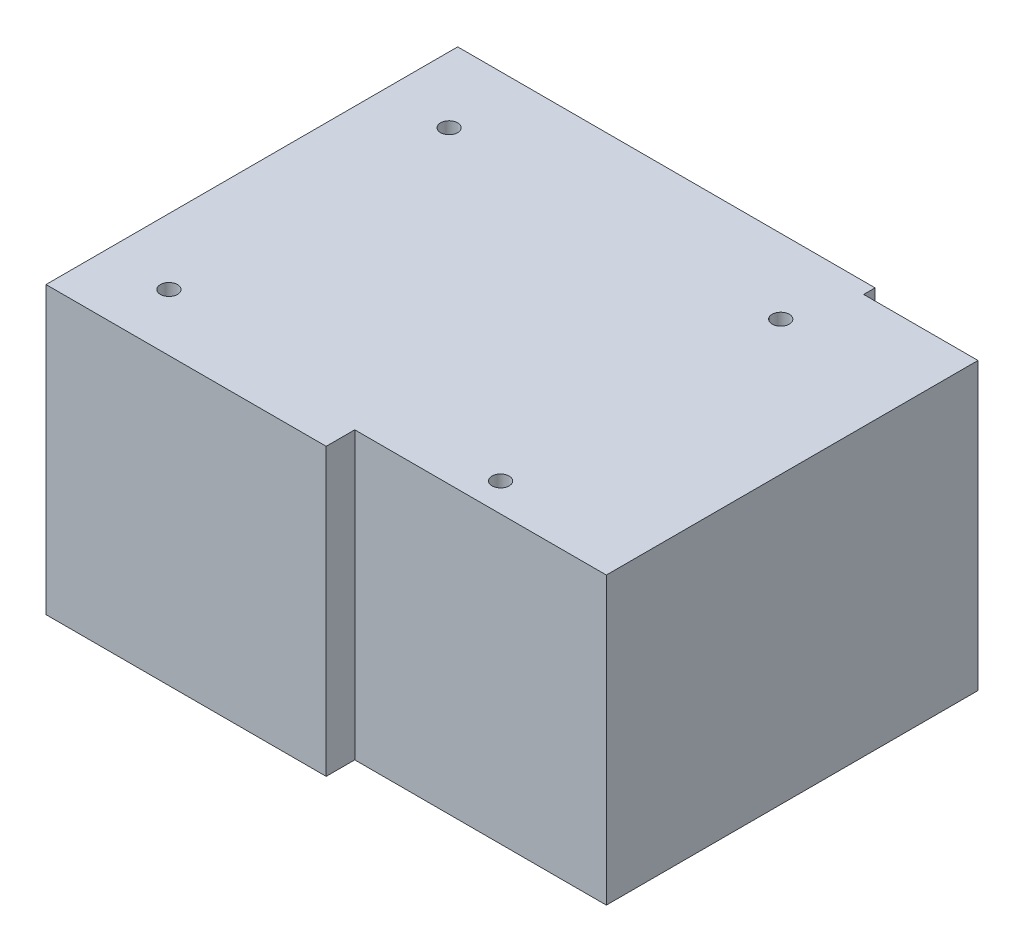
ISO-10303-21;
HEADER;
FILE_DESCRIPTION(('STEP AP214'),'2;1');
FILE_NAME('part.step','',(''),(''),'','','');
FILE_SCHEMA(('AUTOMOTIVE_DESIGN { 1 0 10303 214 1 1 1 1 }'));
ENDSEC;
DATA;
#1=APPLICATION_CONTEXT('core data for automotive mechanical design processes');
#2=APPLICATION_PROTOCOL_DEFINITION('international standard','automotive_design',2000,#1);
#3=PRODUCT_CONTEXT('',#1,'mechanical');
#4=PRODUCT('Part','Part','',(#3));
#5=PRODUCT_RELATED_PRODUCT_CATEGORY('part','',(#4));
#6=PRODUCT_DEFINITION_FORMATION('','',#4);
#7=PRODUCT_DEFINITION_CONTEXT('part definition',#1,'design');
#8=PRODUCT_DEFINITION('design','',#6,#7);
#9=PRODUCT_DEFINITION_SHAPE('','',#8);
#10=(LENGTH_UNIT() NAMED_UNIT(*) SI_UNIT(.MILLI.,.METRE.));
#11=(NAMED_UNIT(*) PLANE_ANGLE_UNIT() SI_UNIT($,.RADIAN.));
#12=(NAMED_UNIT(*) SI_UNIT($,.STERADIAN.) SOLID_ANGLE_UNIT());
#13=UNCERTAINTY_MEASURE_WITH_UNIT(LENGTH_MEASURE(1.E-05),#10,'distance_accuracy_value','');
#14=(GEOMETRIC_REPRESENTATION_CONTEXT(3) GLOBAL_UNCERTAINTY_ASSIGNED_CONTEXT((#13)) GLOBAL_UNIT_ASSIGNED_CONTEXT((#10,
#11,#12)) REPRESENTATION_CONTEXT('',''));
#15=CARTESIAN_POINT('',(0.,0.,0.));
#16=DIRECTION('',(0.,0.,1.));
#17=DIRECTION('',(1.,0.,0.));
#18=AXIS2_PLACEMENT_3D('',#15,#16,#17);
#19=CARTESIAN_POINT('',(0.,50.,0.));
#20=DIRECTION('',(1.,0.,0.));
#21=DIRECTION('',(0.,0.,-1.));
#22=AXIS2_PLACEMENT_3D('',#19,#20,#21);
#23=PLANE('',#22);
#24=DIRECTION('',(0.,0.,1.));
#25=VECTOR('',#24,1.);
#26=CARTESIAN_POINT('',(0.,0.,0.));
#27=LINE('',#26,#25);
#28=CARTESIAN_POINT('',(0.,0.,-72.));
#29=VERTEX_POINT('',#28);
#30=CARTESIAN_POINT('',(0.,0.,0.));
#31=VERTEX_POINT('',#30);
#32=EDGE_CURVE('E130',#29,#31,#27,.T.);
#33=ORIENTED_EDGE('',*,*,#32,.T.);
#34=DIRECTION('',(0.,-1.,0.));
#35=VECTOR('',#34,1.);
#36=CARTESIAN_POINT('',(0.,50.,0.));
#37=LINE('',#36,#35);
#38=CARTESIAN_POINT('',(0.,50.,0.));
#39=VERTEX_POINT('',#38);
#40=EDGE_CURVE('E11',#39,#31,#37,.T.);
#41=ORIENTED_EDGE('',*,*,#40,.F.);
#42=DIRECTION('',(0.,0.,1.));
#43=VECTOR('',#42,1.);
#44=CARTESIAN_POINT('',(0.,50.,0.));
#45=LINE('',#44,#43);
#46=CARTESIAN_POINT('',(0.,50.,-72.));
#47=VERTEX_POINT('',#46);
#48=EDGE_CURVE('E146',#47,#39,#45,.T.);
#49=ORIENTED_EDGE('',*,*,#48,.F.);
#50=DIRECTION('',(0.,-1.,0.));
#51=VECTOR('',#50,1.);
#52=CARTESIAN_POINT('',(0.,50.,-72.));
#53=LINE('',#52,#51);
#54=EDGE_CURVE('E126',#47,#29,#53,.T.);
#55=ORIENTED_EDGE('',*,*,#54,.T.);
#56=EDGE_LOOP('',(#33,#41,#49,#55));
#57=FACE_BOUND('',#56,.T.);
#58=ADVANCED_FACE('F33',(#57),#23,.F.);
#59=CARTESIAN_POINT('',(0.,50.,0.));
#60=DIRECTION('',(0.,0.,-1.));
#61=DIRECTION('',(-1.,0.,0.));
#62=AXIS2_PLACEMENT_3D('',#59,#60,#61);
#63=PLANE('',#62);
#64=DIRECTION('',(1.,0.,0.));
#65=VECTOR('',#64,1.);
#66=CARTESIAN_POINT('',(0.,0.,0.));
#67=LINE('',#66,#65);
#68=CARTESIAN_POINT('',(49.,0.,0.));
#69=VERTEX_POINT('',#68);
#70=EDGE_CURVE('E133',#31,#69,#67,.T.);
#71=ORIENTED_EDGE('',*,*,#70,.T.);
#72=DIRECTION('',(0.,-1.,0.));
#73=VECTOR('',#72,1.);
#74=CARTESIAN_POINT('',(49.,50.,0.));
#75=LINE('',#74,#73);
#76=CARTESIAN_POINT('',(49.,50.,0.));
#77=VERTEX_POINT('',#76);
#78=EDGE_CURVE('E41',#77,#69,#75,.T.);
#79=ORIENTED_EDGE('',*,*,#78,.F.);
#80=DIRECTION('',(1.,0.,0.));
#81=VECTOR('',#80,1.);
#82=CARTESIAN_POINT('',(0.,50.,0.));
#83=LINE('',#82,#81);
#84=EDGE_CURVE('E90',#39,#77,#83,.T.);
#85=ORIENTED_EDGE('',*,*,#84,.F.);
#86=ORIENTED_EDGE('',*,*,#40,.T.);
#87=EDGE_LOOP('',(#71,#79,#85,#86));
#88=FACE_BOUND('',#87,.T.);
#89=ADVANCED_FACE('F235',(#88),#63,.F.);
#90=CARTESIAN_POINT('',(49.,50.,0.));
#91=DIRECTION('',(-1.,0.,0.));
#92=DIRECTION('',(0.,0.,1.));
#93=AXIS2_PLACEMENT_3D('',#90,#91,#92);
#94=PLANE('',#93);
#95=DIRECTION('',(0.,0.,-1.));
#96=VECTOR('',#95,1.);
#97=CARTESIAN_POINT('',(49.,0.,0.));
#98=LINE('',#97,#96);
#99=CARTESIAN_POINT('',(49.,0.,-5.));
#100=VERTEX_POINT('',#99);
#101=EDGE_CURVE('E136',#69,#100,#98,.T.);
#102=ORIENTED_EDGE('',*,*,#101,.T.);
#103=DIRECTION('',(0.,-1.,0.));
#104=VECTOR('',#103,1.);
#105=CARTESIAN_POINT('',(49.,50.,-5.));
#106=LINE('',#105,#104);
#107=CARTESIAN_POINT('',(49.,50.,-5.));
#108=VERTEX_POINT('',#107);
#109=EDGE_CURVE('E153',#108,#100,#106,.T.);
#110=ORIENTED_EDGE('',*,*,#109,.F.);
#111=DIRECTION('',(0.,0.,-1.));
#112=VECTOR('',#111,1.);
#113=CARTESIAN_POINT('',(49.,50.,0.));
#114=LINE('',#113,#112);
#115=EDGE_CURVE('E161',#77,#108,#114,.T.);
#116=ORIENTED_EDGE('',*,*,#115,.F.);
#117=ORIENTED_EDGE('',*,*,#78,.T.);
#118=EDGE_LOOP('',(#102,#110,#116,#117));
#119=FACE_BOUND('',#118,.T.);
#120=ADVANCED_FACE('F159',(#119),#94,.F.);
#121=CARTESIAN_POINT('',(49.,50.,-5.));
#122=DIRECTION('',(0.,0.,-1.));
#123=DIRECTION('',(-1.,0.,0.));
#124=AXIS2_PLACEMENT_3D('',#121,#122,#123);
#125=PLANE('',#124);
#126=DIRECTION('',(1.,0.,0.));
#127=VECTOR('',#126,1.);
#128=CARTESIAN_POINT('',(49.,0.,-5.));
#129=LINE('',#128,#127);
#130=CARTESIAN_POINT('',(93.,0.,-5.));
#131=VERTEX_POINT('',#130);
#132=EDGE_CURVE('E138',#100,#131,#129,.T.);
#133=ORIENTED_EDGE('',*,*,#132,.T.);
#134=DIRECTION('',(0.,-1.,0.));
#135=VECTOR('',#134,1.);
#136=CARTESIAN_POINT('',(93.,50.,-5.));
#137=LINE('',#136,#135);
#138=CARTESIAN_POINT('',(93.,50.,-5.));
#139=VERTEX_POINT('',#138);
#140=EDGE_CURVE('E150',#139,#131,#137,.T.);
#141=ORIENTED_EDGE('',*,*,#140,.F.);
#142=DIRECTION('',(1.,0.,0.));
#143=VECTOR('',#142,1.);
#144=CARTESIAN_POINT('',(49.,50.,-5.));
#145=LINE('',#144,#143);
#146=EDGE_CURVE('E171',#108,#139,#145,.T.);
#147=ORIENTED_EDGE('',*,*,#146,.F.);
#148=ORIENTED_EDGE('',*,*,#109,.T.);
#149=EDGE_LOOP('',(#133,#141,#147,#148));
#150=FACE_BOUND('',#149,.T.);
#151=ADVANCED_FACE('F167',(#150),#125,.F.);
#152=CARTESIAN_POINT('',(93.,50.,-70.));
#153=DIRECTION('',(-1.,0.,0.));
#154=DIRECTION('',(0.,0.,1.));
#155=AXIS2_PLACEMENT_3D('',#152,#153,#154);
#156=PLANE('',#155);
#157=DIRECTION('',(0.,0.,-1.));
#158=VECTOR('',#157,1.);
#159=CARTESIAN_POINT('',(93.,0.,-70.));
#160=LINE('',#159,#158);
#161=CARTESIAN_POINT('',(93.,0.,-70.));
#162=VERTEX_POINT('',#161);
#163=EDGE_CURVE('E140',#131,#162,#160,.T.);
#164=ORIENTED_EDGE('',*,*,#163,.T.);
#165=DIRECTION('',(0.,-1.,0.));
#166=VECTOR('',#165,1.);
#167=CARTESIAN_POINT('',(93.,50.,-70.));
#168=LINE('',#167,#166);
#169=CARTESIAN_POINT('',(93.,50.,-70.));
#170=VERTEX_POINT('',#169);
#171=EDGE_CURVE('E121',#170,#162,#168,.T.);
#172=ORIENTED_EDGE('',*,*,#171,.F.);
#173=DIRECTION('',(0.,0.,-1.));
#174=VECTOR('',#173,1.);
#175=CARTESIAN_POINT('',(93.,50.,-70.));
#176=LINE('',#175,#174);
#177=EDGE_CURVE('E110',#139,#170,#176,.T.);
#178=ORIENTED_EDGE('',*,*,#177,.F.);
#179=ORIENTED_EDGE('',*,*,#140,.T.);
#180=EDGE_LOOP('',(#164,#172,#178,#179));
#181=FACE_BOUND('',#180,.T.);
#182=ADVANCED_FACE('F170',(#181),#156,.F.);
#183=CARTESIAN_POINT('',(73.,50.,-70.));
#184=DIRECTION('',(0.,0.,1.));
#185=DIRECTION('',(1.,0.,0.));
#186=AXIS2_PLACEMENT_3D('',#183,#184,#185);
#187=PLANE('',#186);
#188=DIRECTION('',(-1.,0.,0.));
#189=VECTOR('',#188,1.);
#190=CARTESIAN_POINT('',(73.,0.,-70.));
#191=LINE('',#190,#189);
#192=CARTESIAN_POINT('',(73.,0.,-70.));
#193=VERTEX_POINT('',#192);
#194=EDGE_CURVE('E119',#162,#193,#191,.T.);
#195=ORIENTED_EDGE('',*,*,#194,.T.);
#196=DIRECTION('',(0.,-1.,0.));
#197=VECTOR('',#196,1.);
#198=CARTESIAN_POINT('',(73.,50.,-70.));
#199=LINE('',#198,#197);
#200=CARTESIAN_POINT('',(73.,50.,-70.));
#201=VERTEX_POINT('',#200);
#202=EDGE_CURVE('E116',#201,#193,#199,.T.);
#203=ORIENTED_EDGE('',*,*,#202,.F.);
#204=DIRECTION('',(-1.,0.,0.));
#205=VECTOR('',#204,1.);
#206=CARTESIAN_POINT('',(73.,50.,-70.));
#207=LINE('',#206,#205);
#208=EDGE_CURVE('E103',#170,#201,#207,.T.);
#209=ORIENTED_EDGE('',*,*,#208,.F.);
#210=ORIENTED_EDGE('',*,*,#171,.T.);
#211=EDGE_LOOP('',(#195,#203,#209,#210));
#212=FACE_BOUND('',#211,.T.);
#213=ADVANCED_FACE('F117',(#212),#187,.F.);
#214=CARTESIAN_POINT('',(73.,50.,-72.));
#215=DIRECTION('',(-1.,0.,0.));
#216=DIRECTION('',(0.,0.,1.));
#217=AXIS2_PLACEMENT_3D('',#214,#215,#216);
#218=PLANE('',#217);
#219=DIRECTION('',(0.,0.,-1.));
#220=VECTOR('',#219,1.);
#221=CARTESIAN_POINT('',(73.,0.,-72.));
#222=LINE('',#221,#220);
#223=CARTESIAN_POINT('',(73.,0.,-72.));
#224=VERTEX_POINT('',#223);
#225=EDGE_CURVE('E143',#193,#224,#222,.T.);
#226=ORIENTED_EDGE('',*,*,#225,.T.);
#227=DIRECTION('',(0.,-1.,0.));
#228=VECTOR('',#227,1.);
#229=CARTESIAN_POINT('',(73.,50.,-72.));
#230=LINE('',#229,#228);
#231=CARTESIAN_POINT('',(73.,50.,-72.));
#232=VERTEX_POINT('',#231);
#233=EDGE_CURVE('E122',#232,#224,#230,.T.);
#234=ORIENTED_EDGE('',*,*,#233,.F.);
#235=DIRECTION('',(0.,0.,-1.));
#236=VECTOR('',#235,1.);
#237=CARTESIAN_POINT('',(73.,50.,-72.));
#238=LINE('',#237,#236);
#239=EDGE_CURVE('E107',#201,#232,#238,.T.);
#240=ORIENTED_EDGE('',*,*,#239,.F.);
#241=ORIENTED_EDGE('',*,*,#202,.T.);
#242=EDGE_LOOP('',(#226,#234,#240,#241));
#243=FACE_BOUND('',#242,.T.);
#244=ADVANCED_FACE('F124',(#243),#218,.F.);
#245=CARTESIAN_POINT('',(0.,50.,-72.));
#246=DIRECTION('',(0.,0.,1.));
#247=DIRECTION('',(1.,0.,0.));
#248=AXIS2_PLACEMENT_3D('',#245,#246,#247);
#249=PLANE('',#248);
#250=DIRECTION('',(-1.,0.,0.));
#251=VECTOR('',#250,1.);
#252=CARTESIAN_POINT('',(0.,0.,-72.));
#253=LINE('',#252,#251);
#254=EDGE_CURVE('E78',#224,#29,#253,.T.);
#255=ORIENTED_EDGE('',*,*,#254,.T.);
#256=ORIENTED_EDGE('',*,*,#54,.F.);
#257=DIRECTION('',(-1.,0.,0.));
#258=VECTOR('',#257,1.);
#259=CARTESIAN_POINT('',(52.1816720257235,50.,-72.));
#260=LINE('',#259,#258);
#261=EDGE_CURVE('E49',#232,#47,#260,.T.);
#262=ORIENTED_EDGE('',*,*,#261,.F.);
#263=ORIENTED_EDGE('',*,*,#233,.T.);
#264=EDGE_LOOP('',(#255,#256,#262,#263));
#265=FACE_BOUND('',#264,.T.);
#266=ADVANCED_FACE('F212',(#265),#249,.F.);
#267=CARTESIAN_POINT('',(0.,50.,0.));
#268=DIRECTION('',(0.,-1.,0.));
#269=DIRECTION('',(0.,0.,-1.));
#270=AXIS2_PLACEMENT_3D('',#267,#268,#269);
#271=PLANE('',#270);
#272=CARTESIAN_POINT('',(69.5,50.,-59.));
#273=DIRECTION('',(0.,1.,0.));
#274=DIRECTION('',(0.,0.,1.));
#275=AXIS2_PLACEMENT_3D('',#272,#273,#274);
#276=CIRCLE('',#275,1.5);
#277=CARTESIAN_POINT('',(69.5,50.,-57.5));
#278=VERTEX_POINT('',#277);
#279=EDGE_CURVE('E195',#278,#278,#276,.T.);
#280=ORIENTED_EDGE('',*,*,#279,.F.);
#281=EDGE_LOOP('',(#280));
#282=FACE_BOUND('',#281,.T.);
#283=CARTESIAN_POINT('',(69.5,50.,-9.99999999999999));
#284=DIRECTION('',(0.,1.,0.));
#285=DIRECTION('',(0.,0.,1.));
#286=AXIS2_PLACEMENT_3D('',#283,#284,#285);
#287=CIRCLE('',#286,1.5);
#288=CARTESIAN_POINT('',(69.5,50.,-8.5));
#289=VERTEX_POINT('',#288);
#290=EDGE_CURVE('E189',#289,#289,#287,.T.);
#291=ORIENTED_EDGE('',*,*,#290,.F.);
#292=EDGE_LOOP('',(#291));
#293=FACE_BOUND('',#292,.T.);
#294=CARTESIAN_POINT('',(11.5,50.,-9.99999999999999));
#295=DIRECTION('',(0.,1.,0.));
#296=DIRECTION('',(0.,0.,1.));
#297=AXIS2_PLACEMENT_3D('',#294,#295,#296);
#298=CIRCLE('',#297,1.5);
#299=CARTESIAN_POINT('',(11.5,50.,-8.5));
#300=VERTEX_POINT('',#299);
#301=EDGE_CURVE('E183',#300,#300,#298,.T.);
#302=ORIENTED_EDGE('',*,*,#301,.F.);
#303=EDGE_LOOP('',(#302));
#304=FACE_BOUND('',#303,.T.);
#305=CARTESIAN_POINT('',(11.5,50.,-59.));
#306=DIRECTION('',(0.,1.,0.));
#307=DIRECTION('',(0.,0.,1.));
#308=AXIS2_PLACEMENT_3D('',#305,#306,#307);
#309=CIRCLE('',#308,1.5);
#310=CARTESIAN_POINT('',(11.5,50.,-57.5));
#311=VERTEX_POINT('',#310);
#312=EDGE_CURVE('E177',#311,#311,#309,.T.);
#313=ORIENTED_EDGE('',*,*,#312,.F.);
#314=EDGE_LOOP('',(#313));
#315=FACE_BOUND('',#314,.T.);
#316=ORIENTED_EDGE('',*,*,#48,.T.);
#317=ORIENTED_EDGE('',*,*,#84,.T.);
#318=ORIENTED_EDGE('',*,*,#115,.T.);
#319=ORIENTED_EDGE('',*,*,#146,.T.);
#320=ORIENTED_EDGE('',*,*,#177,.T.);
#321=ORIENTED_EDGE('',*,*,#208,.T.);
#322=ORIENTED_EDGE('',*,*,#239,.T.);
#323=ORIENTED_EDGE('',*,*,#261,.T.);
#324=EDGE_LOOP('',(#316,#317,#318,#319,#320,#321,#322,#323));
#325=FACE_BOUND('',#324,.T.);
#326=ADVANCED_FACE('F105',(#282,#293,#304,#315,#325),#271,.F.);
#327=CARTESIAN_POINT('',(0.,0.,0.));
#328=DIRECTION('',(0.,-1.,0.));
#329=DIRECTION('',(0.,0.,-1.));
#330=AXIS2_PLACEMENT_3D('',#327,#328,#329);
#331=PLANE('',#330);
#332=CARTESIAN_POINT('',(69.5,0.,-59.));
#333=DIRECTION('',(0.,1.,0.));
#334=DIRECTION('',(0.,0.,1.));
#335=AXIS2_PLACEMENT_3D('',#332,#333,#334);
#336=CIRCLE('',#335,1.5);
#337=CARTESIAN_POINT('',(69.5,0.,-57.5));
#338=VERTEX_POINT('',#337);
#339=EDGE_CURVE('E180',#338,#338,#336,.T.);
#340=ORIENTED_EDGE('',*,*,#339,.T.);
#341=EDGE_LOOP('',(#340));
#342=FACE_BOUND('',#341,.T.);
#343=CARTESIAN_POINT('',(69.5,0.,-9.99999999999999));
#344=DIRECTION('',(0.,1.,0.));
#345=DIRECTION('',(0.,0.,1.));
#346=AXIS2_PLACEMENT_3D('',#343,#344,#345);
#347=CIRCLE('',#346,1.5);
#348=CARTESIAN_POINT('',(69.5,0.,-8.5));
#349=VERTEX_POINT('',#348);
#350=EDGE_CURVE('E192',#349,#349,#347,.T.);
#351=ORIENTED_EDGE('',*,*,#350,.T.);
#352=EDGE_LOOP('',(#351));
#353=FACE_BOUND('',#352,.T.);
#354=CARTESIAN_POINT('',(11.5,0.,-9.99999999999999));
#355=DIRECTION('',(0.,1.,0.));
#356=DIRECTION('',(0.,0.,1.));
#357=AXIS2_PLACEMENT_3D('',#354,#355,#356);
#358=CIRCLE('',#357,1.5);
#359=CARTESIAN_POINT('',(11.5,0.,-8.5));
#360=VERTEX_POINT('',#359);
#361=EDGE_CURVE('E186',#360,#360,#358,.T.);
#362=ORIENTED_EDGE('',*,*,#361,.T.);
#363=EDGE_LOOP('',(#362));
#364=FACE_BOUND('',#363,.T.);
#365=CARTESIAN_POINT('',(11.5,0.,-59.));
#366=DIRECTION('',(0.,1.,0.));
#367=DIRECTION('',(0.,0.,1.));
#368=AXIS2_PLACEMENT_3D('',#365,#366,#367);
#369=CIRCLE('',#368,1.5);
#370=CARTESIAN_POINT('',(11.5,0.,-57.5));
#371=VERTEX_POINT('',#370);
#372=EDGE_CURVE('E134',#371,#371,#369,.T.);
#373=ORIENTED_EDGE('',*,*,#372,.T.);
#374=EDGE_LOOP('',(#373));
#375=FACE_BOUND('',#374,.T.);
#376=ORIENTED_EDGE('',*,*,#32,.F.);
#377=ORIENTED_EDGE('',*,*,#254,.F.);
#378=ORIENTED_EDGE('',*,*,#225,.F.);
#379=ORIENTED_EDGE('',*,*,#194,.F.);
#380=ORIENTED_EDGE('',*,*,#163,.F.);
#381=ORIENTED_EDGE('',*,*,#132,.F.);
#382=ORIENTED_EDGE('',*,*,#101,.F.);
#383=ORIENTED_EDGE('',*,*,#70,.F.);
#384=EDGE_LOOP('',(#376,#377,#378,#379,#380,#381,#382,#383));
#385=FACE_BOUND('',#384,.T.);
#386=ADVANCED_FACE('F163',(#342,#353,#364,#375,#385),#331,.T.);
#387=CARTESIAN_POINT('',(11.5,0.,-59.));
#388=DIRECTION('',(0.,1.,0.));
#389=DIRECTION('',(0.,0.,1.));
#390=AXIS2_PLACEMENT_3D('',#387,#388,#389);
#391=CYLINDRICAL_SURFACE('',#390,1.5);
#392=ORIENTED_EDGE('',*,*,#372,.F.);
#393=EDGE_LOOP('',(#392));
#394=FACE_BOUND('',#393,.T.);
#395=ORIENTED_EDGE('',*,*,#312,.T.);
#396=EDGE_LOOP('',(#395));
#397=FACE_BOUND('',#396,.T.);
#398=ADVANCED_FACE('F220',(#394,#397),#391,.F.);
#399=CARTESIAN_POINT('',(11.5,0.,-9.99999999999999));
#400=DIRECTION('',(0.,1.,0.));
#401=DIRECTION('',(0.,0.,1.));
#402=AXIS2_PLACEMENT_3D('',#399,#400,#401);
#403=CYLINDRICAL_SURFACE('',#402,1.5);
#404=ORIENTED_EDGE('',*,*,#361,.F.);
#405=EDGE_LOOP('',(#404));
#406=FACE_BOUND('',#405,.T.);
#407=ORIENTED_EDGE('',*,*,#301,.T.);
#408=EDGE_LOOP('',(#407));
#409=FACE_BOUND('',#408,.T.);
#410=ADVANCED_FACE('F222',(#406,#409),#403,.F.);
#411=CARTESIAN_POINT('',(69.5,0.,-9.99999999999999));
#412=DIRECTION('',(0.,1.,0.));
#413=DIRECTION('',(0.,0.,1.));
#414=AXIS2_PLACEMENT_3D('',#411,#412,#413);
#415=CYLINDRICAL_SURFACE('',#414,1.5);
#416=ORIENTED_EDGE('',*,*,#350,.F.);
#417=EDGE_LOOP('',(#416));
#418=FACE_BOUND('',#417,.T.);
#419=ORIENTED_EDGE('',*,*,#290,.T.);
#420=EDGE_LOOP('',(#419));
#421=FACE_BOUND('',#420,.T.);
#422=ADVANCED_FACE('F206',(#418,#421),#415,.F.);
#423=CARTESIAN_POINT('',(69.5,0.,-59.));
#424=DIRECTION('',(0.,1.,0.));
#425=DIRECTION('',(0.,0.,1.));
#426=AXIS2_PLACEMENT_3D('',#423,#424,#425);
#427=CYLINDRICAL_SURFACE('',#426,1.5);
#428=ORIENTED_EDGE('',*,*,#339,.F.);
#429=EDGE_LOOP('',(#428));
#430=FACE_BOUND('',#429,.T.);
#431=ORIENTED_EDGE('',*,*,#279,.T.);
#432=EDGE_LOOP('',(#431));
#433=FACE_BOUND('',#432,.T.);
#434=ADVANCED_FACE('F203',(#430,#433),#427,.F.);
#435=CLOSED_SHELL('',(#58,#89,#120,#151,#182,#213,#244,#266,#326,#386,#398,#410,#422,#434));
#436=MANIFOLD_SOLID_BREP('B2',#435);
#437=ADVANCED_BREP_SHAPE_REPRESENTATION('',(#18,#436),#14);
#438=SHAPE_DEFINITION_REPRESENTATION(#9,#437);
ENDSEC;
END-ISO-10303-21;
